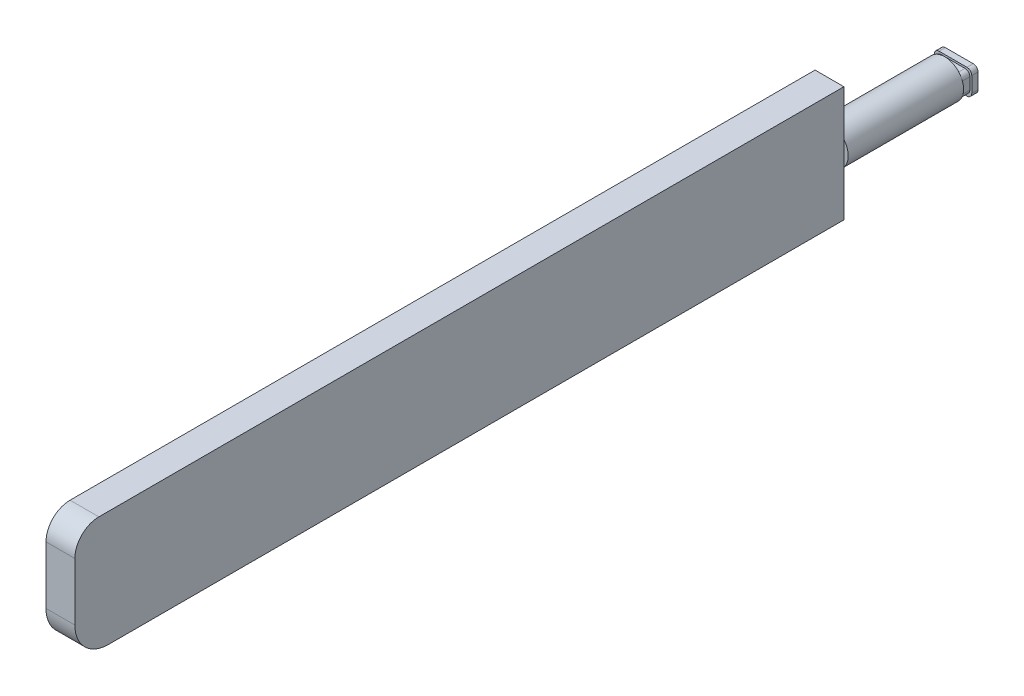
ISO-10303-21;
HEADER;
FILE_DESCRIPTION(('STEP AP214'),'2;1');
FILE_NAME('part.step','',(''),(''),'','','');
FILE_SCHEMA(('AUTOMOTIVE_DESIGN { 1 0 10303 214 1 1 1 1 }'));
ENDSEC;
DATA;
#1=APPLICATION_CONTEXT('core data for automotive mechanical design processes');
#2=APPLICATION_PROTOCOL_DEFINITION('international standard','automotive_design',2000,#1);
#3=PRODUCT_CONTEXT('',#1,'mechanical');
#4=PRODUCT('Part','Part','',(#3));
#5=PRODUCT_RELATED_PRODUCT_CATEGORY('part','',(#4));
#6=PRODUCT_DEFINITION_FORMATION('','',#4);
#7=PRODUCT_DEFINITION_CONTEXT('part definition',#1,'design');
#8=PRODUCT_DEFINITION('design','',#6,#7);
#9=PRODUCT_DEFINITION_SHAPE('','',#8);
#10=(LENGTH_UNIT() NAMED_UNIT(*) SI_UNIT(.MILLI.,.METRE.));
#11=(NAMED_UNIT(*) PLANE_ANGLE_UNIT() SI_UNIT($,.RADIAN.));
#12=(NAMED_UNIT(*) SI_UNIT($,.STERADIAN.) SOLID_ANGLE_UNIT());
#13=UNCERTAINTY_MEASURE_WITH_UNIT(LENGTH_MEASURE(1.E-05),#10,'distance_accuracy_value','');
#14=(GEOMETRIC_REPRESENTATION_CONTEXT(3) GLOBAL_UNCERTAINTY_ASSIGNED_CONTEXT((#13)) GLOBAL_UNIT_ASSIGNED_CONTEXT((#10,
#11,#12)) REPRESENTATION_CONTEXT('',''));
#15=CARTESIAN_POINT('',(0.,0.,0.));
#16=DIRECTION('',(0.,0.,1.));
#17=DIRECTION('',(1.,0.,0.));
#18=AXIS2_PLACEMENT_3D('',#15,#16,#17);
#19=CARTESIAN_POINT('',(15.,-25.,900.));
#20=DIRECTION('',(1.,0.,0.));
#21=DIRECTION('',(0.,0.,-1.));
#22=AXIS2_PLACEMENT_3D('',#19,#20,#21);
#23=CYLINDRICAL_SURFACE('',#22,35.);
#24=DIRECTION('',(1.,0.,0.));
#25=VECTOR('',#24,1.);
#26=CARTESIAN_POINT('',(15.,-25.,935.));
#27=LINE('',#26,#25);
#28=CARTESIAN_POINT('',(-15.,-25.,935.));
#29=VERTEX_POINT('',#28);
#30=CARTESIAN_POINT('',(15.,-25.,935.));
#31=VERTEX_POINT('',#30);
#32=EDGE_CURVE('E375',#29,#31,#27,.T.);
#33=ORIENTED_EDGE('',*,*,#32,.F.);
#34=CARTESIAN_POINT('',(-15.,-25.,900.));
#35=DIRECTION('',(1.,0.,0.));
#36=DIRECTION('',(0.,0.,-1.));
#37=AXIS2_PLACEMENT_3D('',#34,#35,#36);
#38=CIRCLE('',#37,35.);
#39=CARTESIAN_POINT('',(-15.,-60.,900.));
#40=VERTEX_POINT('',#39);
#41=EDGE_CURVE('E47',#40,#29,#38,.F.);
#42=ORIENTED_EDGE('',*,*,#41,.F.);
#43=DIRECTION('',(1.,0.,0.));
#44=VECTOR('',#43,1.);
#45=CARTESIAN_POINT('',(15.,-60.,900.));
#46=LINE('',#45,#44);
#47=CARTESIAN_POINT('',(15.,-60.,900.));
#48=VERTEX_POINT('',#47);
#49=EDGE_CURVE('E374',#48,#40,#46,.F.);
#50=ORIENTED_EDGE('',*,*,#49,.F.);
#51=CARTESIAN_POINT('',(15.,-25.,900.));
#52=DIRECTION('',(1.,0.,0.));
#53=DIRECTION('',(0.,0.,-1.));
#54=AXIS2_PLACEMENT_3D('',#51,#52,#53);
#55=CIRCLE('',#54,35.);
#56=EDGE_CURVE('E11',#31,#48,#55,.T.);
#57=ORIENTED_EDGE('',*,*,#56,.F.);
#58=EDGE_LOOP('',(#33,#42,#50,#57));
#59=FACE_BOUND('',#58,.T.);
#60=ADVANCED_FACE('F45',(#59),#23,.T.);
#61=CARTESIAN_POINT('',(15.,35.,910.));
#62=DIRECTION('',(1.,0.,0.));
#63=DIRECTION('',(0.,0.,-1.));
#64=AXIS2_PLACEMENT_3D('',#61,#62,#63);
#65=CYLINDRICAL_SURFACE('',#64,25.);
#66=DIRECTION('',(1.,0.,0.));
#67=VECTOR('',#66,1.);
#68=CARTESIAN_POINT('',(15.,60.,910.));
#69=LINE('',#68,#67);
#70=CARTESIAN_POINT('',(-15.,60.,910.));
#71=VERTEX_POINT('',#70);
#72=CARTESIAN_POINT('',(15.,60.,910.));
#73=VERTEX_POINT('',#72);
#74=EDGE_CURVE('E217',#71,#73,#69,.T.);
#75=ORIENTED_EDGE('',*,*,#74,.F.);
#76=CARTESIAN_POINT('',(-15.,35.,910.));
#77=DIRECTION('',(1.,0.,0.));
#78=DIRECTION('',(0.,0.,-1.));
#79=AXIS2_PLACEMENT_3D('',#76,#77,#78);
#80=CIRCLE('',#79,25.);
#81=CARTESIAN_POINT('',(-15.,35.,935.));
#82=VERTEX_POINT('',#81);
#83=EDGE_CURVE('E366',#82,#71,#80,.F.);
#84=ORIENTED_EDGE('',*,*,#83,.F.);
#85=DIRECTION('',(1.,0.,0.));
#86=VECTOR('',#85,1.);
#87=CARTESIAN_POINT('',(15.,35.,935.));
#88=LINE('',#87,#86);
#89=CARTESIAN_POINT('',(15.,35.,935.));
#90=VERTEX_POINT('',#89);
#91=EDGE_CURVE('E365',#90,#82,#88,.F.);
#92=ORIENTED_EDGE('',*,*,#91,.F.);
#93=CARTESIAN_POINT('',(15.,35.,910.));
#94=DIRECTION('',(1.,0.,0.));
#95=DIRECTION('',(0.,0.,-1.));
#96=AXIS2_PLACEMENT_3D('',#93,#94,#95);
#97=CIRCLE('',#96,25.);
#98=EDGE_CURVE('E367',#73,#90,#97,.T.);
#99=ORIENTED_EDGE('',*,*,#98,.F.);
#100=EDGE_LOOP('',(#75,#84,#92,#99));
#101=FACE_BOUND('',#100,.T.);
#102=ADVANCED_FACE('F406',(#101),#65,.T.);
#103=CARTESIAN_POINT('',(0.,0.,135.));
#104=DIRECTION('',(0.,0.,1.));
#105=DIRECTION('',(1.,0.,0.));
#106=AXIS2_PLACEMENT_3D('',#103,#104,#105);
#107=PLANE('',#106);
#108=CARTESIAN_POINT('',(0.,0.,135.));
#109=DIRECTION('',(0.,0.,1.));
#110=DIRECTION('',(1.,0.,0.));
#111=AXIS2_PLACEMENT_3D('',#108,#109,#110);
#112=CIRCLE('',#111,19.5);
#113=CARTESIAN_POINT('',(-15.,12.4599357943771,135.));
#114=VERTEX_POINT('',#113);
#115=CARTESIAN_POINT('',(-15.,-12.4599357943771,135.));
#116=VERTEX_POINT('',#115);
#117=EDGE_CURVE('E236',#114,#116,#112,.T.);
#118=ORIENTED_EDGE('',*,*,#117,.T.);
#119=DIRECTION('',(0.,1.,0.));
#120=VECTOR('',#119,1.);
#121=CARTESIAN_POINT('',(-15.,19.5,135.));
#122=LINE('',#121,#120);
#123=EDGE_CURVE('E364',#116,#114,#122,.T.);
#124=ORIENTED_EDGE('',*,*,#123,.T.);
#125=EDGE_LOOP('',(#118,#124));
#126=FACE_BOUND('',#125,.T.);
#127=ADVANCED_FACE('F413',(#126),#107,.T.);
#128=CARTESIAN_POINT('',(19.5,13.,15.));
#129=DIRECTION('',(-1.,0.,0.));
#130=DIRECTION('',(0.,0.,1.));
#131=AXIS2_PLACEMENT_3D('',#128,#129,#130);
#132=PLANE('',#131);
#133=DIRECTION('',(0.,1.,0.));
#134=VECTOR('',#133,1.);
#135=CARTESIAN_POINT('',(19.5,0.,6.5));
#136=LINE('',#135,#134);
#137=CARTESIAN_POINT('',(19.5,-8.,6.5));
#138=VERTEX_POINT('',#137);
#139=CARTESIAN_POINT('',(19.5,8.,6.5));
#140=VERTEX_POINT('',#139);
#141=EDGE_CURVE('E258',#138,#140,#136,.T.);
#142=ORIENTED_EDGE('',*,*,#141,.F.);
#143=DIRECTION('',(0.,0.,-1.));
#144=VECTOR('',#143,1.);
#145=CARTESIAN_POINT('',(19.5,-8.,15.));
#146=LINE('',#145,#144);
#147=CARTESIAN_POINT('',(19.5,-7.99999999999999,0.));
#148=VERTEX_POINT('',#147);
#149=EDGE_CURVE('E288',#138,#148,#146,.T.);
#150=ORIENTED_EDGE('',*,*,#149,.T.);
#151=DIRECTION('',(0.,1.,0.));
#152=VECTOR('',#151,1.);
#153=CARTESIAN_POINT('',(19.5,13.,0.));
#154=LINE('',#153,#152);
#155=CARTESIAN_POINT('',(19.5,8.,0.));
#156=VERTEX_POINT('',#155);
#157=EDGE_CURVE('E264',#148,#156,#154,.T.);
#158=ORIENTED_EDGE('',*,*,#157,.T.);
#159=DIRECTION('',(0.,0.,-1.));
#160=VECTOR('',#159,1.);
#161=CARTESIAN_POINT('',(19.5,8.,15.));
#162=LINE('',#161,#160);
#163=EDGE_CURVE('E287',#156,#140,#162,.F.);
#164=ORIENTED_EDGE('',*,*,#163,.T.);
#165=EDGE_LOOP('',(#142,#150,#158,#164));
#166=FACE_BOUND('',#165,.T.);
#167=ADVANCED_FACE('F418',(#166),#132,.F.);
#168=CARTESIAN_POINT('',(-19.5,13.,15.));
#169=DIRECTION('',(0.,-1.,0.));
#170=DIRECTION('',(0.,0.,-1.));
#171=AXIS2_PLACEMENT_3D('',#168,#169,#170);
#172=PLANE('',#171);
#173=DIRECTION('',(-1.,0.,0.));
#174=VECTOR('',#173,1.);
#175=CARTESIAN_POINT('',(0.,13.,6.5));
#176=LINE('',#175,#174);
#177=CARTESIAN_POINT('',(14.5,13.,6.5));
#178=VERTEX_POINT('',#177);
#179=CARTESIAN_POINT('',(-14.5,13.,6.5));
#180=VERTEX_POINT('',#179);
#181=EDGE_CURVE('E259',#178,#180,#176,.T.);
#182=ORIENTED_EDGE('',*,*,#181,.F.);
#183=DIRECTION('',(0.,0.,-1.));
#184=VECTOR('',#183,1.);
#185=CARTESIAN_POINT('',(14.5,13.,15.));
#186=LINE('',#185,#184);
#187=CARTESIAN_POINT('',(14.5,13.,0.));
#188=VERTEX_POINT('',#187);
#189=EDGE_CURVE('E312',#178,#188,#186,.T.);
#190=ORIENTED_EDGE('',*,*,#189,.T.);
#191=DIRECTION('',(-1.,0.,0.));
#192=VECTOR('',#191,1.);
#193=CARTESIAN_POINT('',(-19.5,13.,0.));
#194=LINE('',#193,#192);
#195=CARTESIAN_POINT('',(-14.5,13.,0.));
#196=VERTEX_POINT('',#195);
#197=EDGE_CURVE('E279',#188,#196,#194,.T.);
#198=ORIENTED_EDGE('',*,*,#197,.T.);
#199=DIRECTION('',(0.,0.,-1.));
#200=VECTOR('',#199,1.);
#201=CARTESIAN_POINT('',(-14.5,13.,15.));
#202=LINE('',#201,#200);
#203=EDGE_CURVE('E311',#196,#180,#202,.F.);
#204=ORIENTED_EDGE('',*,*,#203,.T.);
#205=EDGE_LOOP('',(#182,#190,#198,#204));
#206=FACE_BOUND('',#205,.T.);
#207=ADVANCED_FACE('F457',(#206),#172,.F.);
#208=CARTESIAN_POINT('',(-19.5,13.,15.));
#209=DIRECTION('',(1.,0.,0.));
#210=DIRECTION('',(0.,0.,-1.));
#211=AXIS2_PLACEMENT_3D('',#208,#209,#210);
#212=PLANE('',#211);
#213=DIRECTION('',(0.,-1.,0.));
#214=VECTOR('',#213,1.);
#215=CARTESIAN_POINT('',(-19.5,13.,0.));
#216=LINE('',#215,#214);
#217=CARTESIAN_POINT('',(-19.5,8.,0.));
#218=VERTEX_POINT('',#217);
#219=CARTESIAN_POINT('',(-19.5,-7.99999999999999,0.));
#220=VERTEX_POINT('',#219);
#221=EDGE_CURVE('E283',#218,#220,#216,.T.);
#222=ORIENTED_EDGE('',*,*,#221,.T.);
#223=DIRECTION('',(0.,0.,-1.));
#224=VECTOR('',#223,1.);
#225=CARTESIAN_POINT('',(-19.5,-8.,15.));
#226=LINE('',#225,#224);
#227=CARTESIAN_POINT('',(-19.5,-8.,6.5));
#228=VERTEX_POINT('',#227);
#229=EDGE_CURVE('E321',#220,#228,#226,.F.);
#230=ORIENTED_EDGE('',*,*,#229,.T.);
#231=DIRECTION('',(0.,-1.,0.));
#232=VECTOR('',#231,1.);
#233=CARTESIAN_POINT('',(-19.5,0.,6.5));
#234=LINE('',#233,#232);
#235=CARTESIAN_POINT('',(-19.5,8.,6.5));
#236=VERTEX_POINT('',#235);
#237=EDGE_CURVE('E265',#236,#228,#234,.T.);
#238=ORIENTED_EDGE('',*,*,#237,.F.);
#239=DIRECTION('',(0.,0.,-1.));
#240=VECTOR('',#239,1.);
#241=CARTESIAN_POINT('',(-19.5,8.,15.));
#242=LINE('',#241,#240);
#243=EDGE_CURVE('E318',#236,#218,#242,.T.);
#244=ORIENTED_EDGE('',*,*,#243,.T.);
#245=EDGE_LOOP('',(#222,#230,#238,#244));
#246=FACE_BOUND('',#245,.T.);
#247=ADVANCED_FACE('F458',(#246),#212,.F.);
#248=CARTESIAN_POINT('',(-19.5,-13.,15.));
#249=DIRECTION('',(0.,1.,0.));
#250=DIRECTION('',(0.,0.,1.));
#251=AXIS2_PLACEMENT_3D('',#248,#249,#250);
#252=PLANE('',#251);
#253=DIRECTION('',(1.,0.,0.));
#254=VECTOR('',#253,1.);
#255=CARTESIAN_POINT('',(-19.5,-13.,0.));
#256=LINE('',#255,#254);
#257=CARTESIAN_POINT('',(-14.5,-13.,0.));
#258=VERTEX_POINT('',#257);
#259=CARTESIAN_POINT('',(14.5,-13.,0.));
#260=VERTEX_POINT('',#259);
#261=EDGE_CURVE('E282',#258,#260,#256,.T.);
#262=ORIENTED_EDGE('',*,*,#261,.T.);
#263=DIRECTION('',(0.,0.,-1.));
#264=VECTOR('',#263,1.);
#265=CARTESIAN_POINT('',(14.5,-13.,15.));
#266=LINE('',#265,#264);
#267=CARTESIAN_POINT('',(14.5,-13.,6.5));
#268=VERTEX_POINT('',#267);
#269=EDGE_CURVE('E302',#260,#268,#266,.F.);
#270=ORIENTED_EDGE('',*,*,#269,.T.);
#271=DIRECTION('',(1.,0.,0.));
#272=VECTOR('',#271,1.);
#273=CARTESIAN_POINT('',(0.,-13.,6.5));
#274=LINE('',#273,#272);
#275=CARTESIAN_POINT('',(-14.5,-13.,6.5));
#276=VERTEX_POINT('',#275);
#277=EDGE_CURVE('E251',#276,#268,#274,.T.);
#278=ORIENTED_EDGE('',*,*,#277,.F.);
#279=DIRECTION('',(0.,0.,-1.));
#280=VECTOR('',#279,1.);
#281=CARTESIAN_POINT('',(-14.5,-13.,15.));
#282=LINE('',#281,#280);
#283=EDGE_CURVE('E299',#276,#258,#282,.T.);
#284=ORIENTED_EDGE('',*,*,#283,.T.);
#285=EDGE_LOOP('',(#262,#270,#278,#284));
#286=FACE_BOUND('',#285,.T.);
#287=ADVANCED_FACE('F462',(#286),#252,.F.);
#288=CARTESIAN_POINT('',(0.,0.,0.));
#289=DIRECTION('',(0.,0.,1.));
#290=DIRECTION('',(1.,0.,0.));
#291=AXIS2_PLACEMENT_3D('',#288,#289,#290);
#292=PLANE('',#291);
#293=ORIENTED_EDGE('',*,*,#157,.F.);
#294=CARTESIAN_POINT('',(14.5,-8.,0.));
#295=DIRECTION('',(0.,0.,1.));
#296=DIRECTION('',(1.,0.,0.));
#297=AXIS2_PLACEMENT_3D('',#294,#295,#296);
#298=CIRCLE('',#297,5.);
#299=EDGE_CURVE('E296',#148,#260,#298,.F.);
#300=ORIENTED_EDGE('',*,*,#299,.T.);
#301=ORIENTED_EDGE('',*,*,#261,.F.);
#302=CARTESIAN_POINT('',(-14.5,-8.,0.));
#303=DIRECTION('',(0.,0.,1.));
#304=DIRECTION('',(1.,0.,0.));
#305=AXIS2_PLACEMENT_3D('',#302,#303,#304);
#306=CIRCLE('',#305,5.);
#307=EDGE_CURVE('E294',#258,#220,#306,.F.);
#308=ORIENTED_EDGE('',*,*,#307,.T.);
#309=ORIENTED_EDGE('',*,*,#221,.F.);
#310=CARTESIAN_POINT('',(-14.5,8.,0.));
#311=DIRECTION('',(0.,0.,1.));
#312=DIRECTION('',(1.,0.,0.));
#313=AXIS2_PLACEMENT_3D('',#310,#311,#312);
#314=CIRCLE('',#313,5.);
#315=EDGE_CURVE('E295',#218,#196,#314,.F.);
#316=ORIENTED_EDGE('',*,*,#315,.T.);
#317=ORIENTED_EDGE('',*,*,#197,.F.);
#318=CARTESIAN_POINT('',(14.5,8.,0.));
#319=DIRECTION('',(0.,0.,1.));
#320=DIRECTION('',(1.,0.,0.));
#321=AXIS2_PLACEMENT_3D('',#318,#319,#320);
#322=CIRCLE('',#321,5.);
#323=EDGE_CURVE('E298',#188,#156,#322,.F.);
#324=ORIENTED_EDGE('',*,*,#323,.T.);
#325=EDGE_LOOP('',(#293,#300,#301,#308,#309,#316,#317,#324));
#326=FACE_BOUND('',#325,.T.);
#327=ADVANCED_FACE('F467',(#326),#292,.F.);
#328=CARTESIAN_POINT('',(17.5,0.,6.5));
#329=DIRECTION('',(1.,0.,0.));
#330=DIRECTION('',(0.,0.,-1.));
#331=AXIS2_PLACEMENT_3D('',#328,#329,#330);
#332=PLANE('',#331);
#333=DIRECTION('',(0.,1.,0.));
#334=VECTOR('',#333,1.);
#335=CARTESIAN_POINT('',(17.5,0.,15.));
#336=LINE('',#335,#334);
#337=CARTESIAN_POINT('',(17.5,-6.,15.));
#338=VERTEX_POINT('',#337);
#339=CARTESIAN_POINT('',(17.5,6.,15.));
#340=VERTEX_POINT('',#339);
#341=EDGE_CURVE('E240',#338,#340,#336,.T.);
#342=ORIENTED_EDGE('',*,*,#341,.F.);
#343=DIRECTION('',(0.,0.,1.));
#344=VECTOR('',#343,1.);
#345=CARTESIAN_POINT('',(17.5,-6.,6.5));
#346=LINE('',#345,#344);
#347=CARTESIAN_POINT('',(17.5,-6.,6.5));
#348=VERTEX_POINT('',#347);
#349=EDGE_CURVE('E346',#338,#348,#346,.F.);
#350=ORIENTED_EDGE('',*,*,#349,.T.);
#351=DIRECTION('',(0.,1.,0.));
#352=VECTOR('',#351,1.);
#353=CARTESIAN_POINT('',(17.5,0.,6.5));
#354=LINE('',#353,#352);
#355=CARTESIAN_POINT('',(17.5,6.,6.5));
#356=VERTEX_POINT('',#355);
#357=EDGE_CURVE('E238',#348,#356,#354,.T.);
#358=ORIENTED_EDGE('',*,*,#357,.T.);
#359=DIRECTION('',(0.,0.,1.));
#360=VECTOR('',#359,1.);
#361=CARTESIAN_POINT('',(17.5,6.,6.5));
#362=LINE('',#361,#360);
#363=EDGE_CURVE('E345',#356,#340,#362,.T.);
#364=ORIENTED_EDGE('',*,*,#363,.T.);
#365=EDGE_LOOP('',(#342,#350,#358,#364));
#366=FACE_BOUND('',#365,.T.);
#367=ADVANCED_FACE('F472',(#366),#332,.T.);
#368=CARTESIAN_POINT('',(0.,11.,6.5));
#369=DIRECTION('',(0.,1.,0.));
#370=DIRECTION('',(0.,0.,1.));
#371=AXIS2_PLACEMENT_3D('',#368,#369,#370);
#372=PLANE('',#371);
#373=DIRECTION('',(-1.,0.,0.));
#374=VECTOR('',#373,1.);
#375=CARTESIAN_POINT('',(0.,11.,15.));
#376=LINE('',#375,#374);
#377=CARTESIAN_POINT('',(12.5,11.,15.));
#378=VERTEX_POINT('',#377);
#379=CARTESIAN_POINT('',(-12.5,11.,15.));
#380=VERTEX_POINT('',#379);
#381=EDGE_CURVE('E242',#378,#380,#376,.T.);
#382=ORIENTED_EDGE('',*,*,#381,.F.);
#383=DIRECTION('',(0.,0.,1.));
#384=VECTOR('',#383,1.);
#385=CARTESIAN_POINT('',(12.5,11.,6.5));
#386=LINE('',#385,#384);
#387=CARTESIAN_POINT('',(12.5,11.,6.5));
#388=VERTEX_POINT('',#387);
#389=EDGE_CURVE('E351',#378,#388,#386,.F.);
#390=ORIENTED_EDGE('',*,*,#389,.T.);
#391=DIRECTION('',(-1.,0.,0.));
#392=VECTOR('',#391,1.);
#393=CARTESIAN_POINT('',(0.,11.,6.5));
#394=LINE('',#393,#392);
#395=CARTESIAN_POINT('',(-12.5,11.,6.5));
#396=VERTEX_POINT('',#395);
#397=EDGE_CURVE('E246',#388,#396,#394,.T.);
#398=ORIENTED_EDGE('',*,*,#397,.T.);
#399=DIRECTION('',(0.,0.,1.));
#400=VECTOR('',#399,1.);
#401=CARTESIAN_POINT('',(-12.5,11.,6.5));
#402=LINE('',#401,#400);
#403=EDGE_CURVE('E348',#396,#380,#402,.T.);
#404=ORIENTED_EDGE('',*,*,#403,.T.);
#405=EDGE_LOOP('',(#382,#390,#398,#404));
#406=FACE_BOUND('',#405,.T.);
#407=ADVANCED_FACE('F478',(#406),#372,.T.);
#408=CARTESIAN_POINT('',(-17.5,0.,6.5));
#409=DIRECTION('',(-1.,0.,0.));
#410=DIRECTION('',(0.,0.,1.));
#411=AXIS2_PLACEMENT_3D('',#408,#409,#410);
#412=PLANE('',#411);
#413=DIRECTION('',(0.,-1.,0.));
#414=VECTOR('',#413,1.);
#415=CARTESIAN_POINT('',(-17.5,0.,6.5));
#416=LINE('',#415,#414);
#417=CARTESIAN_POINT('',(-17.5,6.,6.5));
#418=VERTEX_POINT('',#417);
#419=CARTESIAN_POINT('',(-17.5,-6.,6.5));
#420=VERTEX_POINT('',#419);
#421=EDGE_CURVE('E249',#418,#420,#416,.T.);
#422=ORIENTED_EDGE('',*,*,#421,.T.);
#423=DIRECTION('',(0.,0.,1.));
#424=VECTOR('',#423,1.);
#425=CARTESIAN_POINT('',(-17.5,-6.,6.5));
#426=LINE('',#425,#424);
#427=CARTESIAN_POINT('',(-17.5,-6.,15.));
#428=VERTEX_POINT('',#427);
#429=EDGE_CURVE('E324',#420,#428,#426,.T.);
#430=ORIENTED_EDGE('',*,*,#429,.T.);
#431=DIRECTION('',(0.,-1.,0.));
#432=VECTOR('',#431,1.);
#433=CARTESIAN_POINT('',(-17.5,0.,15.));
#434=LINE('',#433,#432);
#435=CARTESIAN_POINT('',(-17.5,6.,15.));
#436=VERTEX_POINT('',#435);
#437=EDGE_CURVE('E271',#436,#428,#434,.T.);
#438=ORIENTED_EDGE('',*,*,#437,.F.);
#439=DIRECTION('',(0.,0.,1.));
#440=VECTOR('',#439,1.);
#441=CARTESIAN_POINT('',(-17.5,6.,6.5));
#442=LINE('',#441,#440);
#443=EDGE_CURVE('E323',#436,#418,#442,.F.);
#444=ORIENTED_EDGE('',*,*,#443,.T.);
#445=EDGE_LOOP('',(#422,#430,#438,#444));
#446=FACE_BOUND('',#445,.T.);
#447=ADVANCED_FACE('F481',(#446),#412,.T.);
#448=CARTESIAN_POINT('',(0.,-11.,6.5));
#449=DIRECTION('',(0.,-1.,0.));
#450=DIRECTION('',(0.,0.,-1.));
#451=AXIS2_PLACEMENT_3D('',#448,#449,#450);
#452=PLANE('',#451);
#453=DIRECTION('',(1.,0.,0.));
#454=VECTOR('',#453,1.);
#455=CARTESIAN_POINT('',(0.,-11.,15.));
#456=LINE('',#455,#454);
#457=CARTESIAN_POINT('',(-12.5,-11.,15.));
#458=VERTEX_POINT('',#457);
#459=CARTESIAN_POINT('',(12.5,-11.,15.));
#460=VERTEX_POINT('',#459);
#461=EDGE_CURVE('E268',#458,#460,#456,.T.);
#462=ORIENTED_EDGE('',*,*,#461,.F.);
#463=DIRECTION('',(0.,0.,1.));
#464=VECTOR('',#463,1.);
#465=CARTESIAN_POINT('',(-12.5,-11.,6.5));
#466=LINE('',#465,#464);
#467=CARTESIAN_POINT('',(-12.5,-11.,6.5));
#468=VERTEX_POINT('',#467);
#469=EDGE_CURVE('E344',#458,#468,#466,.F.);
#470=ORIENTED_EDGE('',*,*,#469,.T.);
#471=DIRECTION('',(1.,0.,0.));
#472=VECTOR('',#471,1.);
#473=CARTESIAN_POINT('',(0.,-11.,6.5));
#474=LINE('',#473,#472);
#475=CARTESIAN_POINT('',(12.5,-11.,6.5));
#476=VERTEX_POINT('',#475);
#477=EDGE_CURVE('E241',#468,#476,#474,.T.);
#478=ORIENTED_EDGE('',*,*,#477,.T.);
#479=DIRECTION('',(0.,0.,1.));
#480=VECTOR('',#479,1.);
#481=CARTESIAN_POINT('',(12.5,-11.,6.5));
#482=LINE('',#481,#480);
#483=EDGE_CURVE('E339',#476,#460,#482,.T.);
#484=ORIENTED_EDGE('',*,*,#483,.T.);
#485=EDGE_LOOP('',(#462,#470,#478,#484));
#486=FACE_BOUND('',#485,.T.);
#487=ADVANCED_FACE('F476',(#486),#452,.T.);
#488=CARTESIAN_POINT('',(0.,0.,6.5));
#489=DIRECTION('',(0.,0.,1.));
#490=DIRECTION('',(1.,0.,0.));
#491=AXIS2_PLACEMENT_3D('',#488,#489,#490);
#492=PLANE('',#491);
#493=ORIENTED_EDGE('',*,*,#357,.F.);
#494=CARTESIAN_POINT('',(12.5,-6.,6.5));
#495=DIRECTION('',(0.,0.,1.));
#496=DIRECTION('',(1.,0.,0.));
#497=AXIS2_PLACEMENT_3D('',#494,#495,#496);
#498=CIRCLE('',#497,5.);
#499=EDGE_CURVE('E359',#348,#476,#498,.F.);
#500=ORIENTED_EDGE('',*,*,#499,.T.);
#501=ORIENTED_EDGE('',*,*,#477,.F.);
#502=CARTESIAN_POINT('',(-12.5,-6.,6.5));
#503=DIRECTION('',(0.,0.,1.));
#504=DIRECTION('',(1.,0.,0.));
#505=AXIS2_PLACEMENT_3D('',#502,#503,#504);
#506=CIRCLE('',#505,5.);
#507=EDGE_CURVE('E354',#468,#420,#506,.F.);
#508=ORIENTED_EDGE('',*,*,#507,.T.);
#509=ORIENTED_EDGE('',*,*,#421,.F.);
#510=CARTESIAN_POINT('',(-12.5,6.,6.5));
#511=DIRECTION('',(0.,0.,1.));
#512=DIRECTION('',(1.,0.,0.));
#513=AXIS2_PLACEMENT_3D('',#510,#511,#512);
#514=CIRCLE('',#513,5.);
#515=EDGE_CURVE('E363',#418,#396,#514,.F.);
#516=ORIENTED_EDGE('',*,*,#515,.T.);
#517=ORIENTED_EDGE('',*,*,#397,.F.);
#518=CARTESIAN_POINT('',(12.5,6.,6.5));
#519=DIRECTION('',(0.,0.,1.));
#520=DIRECTION('',(1.,0.,0.));
#521=AXIS2_PLACEMENT_3D('',#518,#519,#520);
#522=CIRCLE('',#521,5.);
#523=EDGE_CURVE('E360',#388,#356,#522,.F.);
#524=ORIENTED_EDGE('',*,*,#523,.T.);
#525=EDGE_LOOP('',(#493,#500,#501,#508,#509,#516,#517,#524));
#526=FACE_BOUND('',#525,.T.);
#527=ORIENTED_EDGE('',*,*,#277,.T.);
#528=CARTESIAN_POINT('',(14.5,-8.,6.5));
#529=DIRECTION('',(0.,0.,1.));
#530=DIRECTION('',(1.,0.,0.));
#531=AXIS2_PLACEMENT_3D('',#528,#529,#530);
#532=CIRCLE('',#531,5.);
#533=EDGE_CURVE('E313',#268,#138,#532,.T.);
#534=ORIENTED_EDGE('',*,*,#533,.T.);
#535=ORIENTED_EDGE('',*,*,#141,.T.);
#536=CARTESIAN_POINT('',(14.5,8.,6.5));
#537=DIRECTION('',(0.,0.,1.));
#538=DIRECTION('',(1.,0.,0.));
#539=AXIS2_PLACEMENT_3D('',#536,#537,#538);
#540=CIRCLE('',#539,5.);
#541=EDGE_CURVE('E310',#140,#178,#540,.T.);
#542=ORIENTED_EDGE('',*,*,#541,.T.);
#543=ORIENTED_EDGE('',*,*,#181,.T.);
#544=CARTESIAN_POINT('',(-14.5,8.,6.5));
#545=DIRECTION('',(0.,0.,1.));
#546=DIRECTION('',(1.,0.,0.));
#547=AXIS2_PLACEMENT_3D('',#544,#545,#546);
#548=CIRCLE('',#547,5.);
#549=EDGE_CURVE('E301',#180,#236,#548,.T.);
#550=ORIENTED_EDGE('',*,*,#549,.T.);
#551=ORIENTED_EDGE('',*,*,#237,.T.);
#552=CARTESIAN_POINT('',(-14.5,-8.,6.5));
#553=DIRECTION('',(0.,0.,1.));
#554=DIRECTION('',(1.,0.,0.));
#555=AXIS2_PLACEMENT_3D('',#552,#553,#554);
#556=CIRCLE('',#555,5.);
#557=EDGE_CURVE('E307',#228,#276,#556,.T.);
#558=ORIENTED_EDGE('',*,*,#557,.T.);
#559=EDGE_LOOP('',(#527,#534,#535,#542,#543,#550,#551,#558));
#560=FACE_BOUND('',#559,.T.);
#561=ADVANCED_FACE('F452',(#526,#560),#492,.T.);
#562=CARTESIAN_POINT('',(14.5,-8.,15.));
#563=DIRECTION('',(0.,0.,-1.));
#564=DIRECTION('',(-1.,0.,0.));
#565=AXIS2_PLACEMENT_3D('',#562,#563,#564);
#566=CYLINDRICAL_SURFACE('',#565,5.);
#567=ORIENTED_EDGE('',*,*,#533,.F.);
#568=ORIENTED_EDGE('',*,*,#269,.F.);
#569=ORIENTED_EDGE('',*,*,#299,.F.);
#570=ORIENTED_EDGE('',*,*,#149,.F.);
#571=EDGE_LOOP('',(#567,#568,#569,#570));
#572=FACE_BOUND('',#571,.T.);
#573=ADVANCED_FACE('F446',(#572),#566,.T.);
#574=CARTESIAN_POINT('',(14.5,8.,15.));
#575=DIRECTION('',(0.,0.,-1.));
#576=DIRECTION('',(-1.,0.,0.));
#577=AXIS2_PLACEMENT_3D('',#574,#575,#576);
#578=CYLINDRICAL_SURFACE('',#577,5.);
#579=ORIENTED_EDGE('',*,*,#541,.F.);
#580=ORIENTED_EDGE('',*,*,#163,.F.);
#581=ORIENTED_EDGE('',*,*,#323,.F.);
#582=ORIENTED_EDGE('',*,*,#189,.F.);
#583=EDGE_LOOP('',(#579,#580,#581,#582));
#584=FACE_BOUND('',#583,.T.);
#585=ADVANCED_FACE('F441',(#584),#578,.T.);
#586=CARTESIAN_POINT('',(-14.5,-8.,15.));
#587=DIRECTION('',(0.,0.,-1.));
#588=DIRECTION('',(-1.,0.,0.));
#589=AXIS2_PLACEMENT_3D('',#586,#587,#588);
#590=CYLINDRICAL_SURFACE('',#589,5.);
#591=ORIENTED_EDGE('',*,*,#557,.F.);
#592=ORIENTED_EDGE('',*,*,#229,.F.);
#593=ORIENTED_EDGE('',*,*,#307,.F.);
#594=ORIENTED_EDGE('',*,*,#283,.F.);
#595=EDGE_LOOP('',(#591,#592,#593,#594));
#596=FACE_BOUND('',#595,.T.);
#597=ADVANCED_FACE('F439',(#596),#590,.T.);
#598=CARTESIAN_POINT('',(-14.5,8.,15.));
#599=DIRECTION('',(0.,0.,-1.));
#600=DIRECTION('',(-1.,0.,0.));
#601=AXIS2_PLACEMENT_3D('',#598,#599,#600);
#602=CYLINDRICAL_SURFACE('',#601,5.);
#603=ORIENTED_EDGE('',*,*,#549,.F.);
#604=ORIENTED_EDGE('',*,*,#203,.F.);
#605=ORIENTED_EDGE('',*,*,#315,.F.);
#606=ORIENTED_EDGE('',*,*,#243,.F.);
#607=EDGE_LOOP('',(#603,#604,#605,#606));
#608=FACE_BOUND('',#607,.T.);
#609=ADVANCED_FACE('F436',(#608),#602,.T.);
#610=CARTESIAN_POINT('',(-12.5,-6.,6.5));
#611=DIRECTION('',(0.,0.,1.));
#612=DIRECTION('',(1.,0.,0.));
#613=AXIS2_PLACEMENT_3D('',#610,#611,#612);
#614=CYLINDRICAL_SURFACE('',#613,5.);
#615=ORIENTED_EDGE('',*,*,#507,.F.);
#616=ORIENTED_EDGE('',*,*,#469,.F.);
#617=CARTESIAN_POINT('',(-12.5,-6.,15.));
#618=DIRECTION('',(0.,0.,1.));
#619=DIRECTION('',(1.,0.,0.));
#620=AXIS2_PLACEMENT_3D('',#617,#618,#619);
#621=CIRCLE('',#620,5.);
#622=EDGE_CURVE('E340',#428,#458,#621,.T.);
#623=ORIENTED_EDGE('',*,*,#622,.F.);
#624=ORIENTED_EDGE('',*,*,#429,.F.);
#625=EDGE_LOOP('',(#615,#616,#623,#624));
#626=FACE_BOUND('',#625,.T.);
#627=ADVANCED_FACE('F435',(#626),#614,.T.);
#628=CARTESIAN_POINT('',(12.5,-6.,6.5));
#629=DIRECTION('',(0.,0.,1.));
#630=DIRECTION('',(1.,0.,0.));
#631=AXIS2_PLACEMENT_3D('',#628,#629,#630);
#632=CYLINDRICAL_SURFACE('',#631,5.);
#633=ORIENTED_EDGE('',*,*,#499,.F.);
#634=ORIENTED_EDGE('',*,*,#349,.F.);
#635=CARTESIAN_POINT('',(12.5,-6.,15.));
#636=DIRECTION('',(0.,0.,1.));
#637=DIRECTION('',(1.,0.,0.));
#638=AXIS2_PLACEMENT_3D('',#635,#636,#637);
#639=CIRCLE('',#638,5.);
#640=EDGE_CURVE('E331',#460,#338,#639,.T.);
#641=ORIENTED_EDGE('',*,*,#640,.F.);
#642=ORIENTED_EDGE('',*,*,#483,.F.);
#643=EDGE_LOOP('',(#633,#634,#641,#642));
#644=FACE_BOUND('',#643,.T.);
#645=ADVANCED_FACE('F428',(#644),#632,.T.);
#646=CARTESIAN_POINT('',(12.5,6.,6.5));
#647=DIRECTION('',(0.,0.,1.));
#648=DIRECTION('',(1.,0.,0.));
#649=AXIS2_PLACEMENT_3D('',#646,#647,#648);
#650=CYLINDRICAL_SURFACE('',#649,5.);
#651=ORIENTED_EDGE('',*,*,#523,.F.);
#652=ORIENTED_EDGE('',*,*,#389,.F.);
#653=CARTESIAN_POINT('',(12.5,6.,15.));
#654=DIRECTION('',(0.,0.,1.));
#655=DIRECTION('',(1.,0.,0.));
#656=AXIS2_PLACEMENT_3D('',#653,#654,#655);
#657=CIRCLE('',#656,5.);
#658=EDGE_CURVE('E332',#340,#378,#657,.T.);
#659=ORIENTED_EDGE('',*,*,#658,.F.);
#660=ORIENTED_EDGE('',*,*,#363,.F.);
#661=EDGE_LOOP('',(#651,#652,#659,#660));
#662=FACE_BOUND('',#661,.T.);
#663=ADVANCED_FACE('F424',(#662),#650,.T.);
#664=CARTESIAN_POINT('',(-12.5,6.,6.5));
#665=DIRECTION('',(0.,0.,1.));
#666=DIRECTION('',(1.,0.,0.));
#667=AXIS2_PLACEMENT_3D('',#664,#665,#666);
#668=CYLINDRICAL_SURFACE('',#667,5.);
#669=ORIENTED_EDGE('',*,*,#515,.F.);
#670=ORIENTED_EDGE('',*,*,#443,.F.);
#671=CARTESIAN_POINT('',(-12.5,6.,15.));
#672=DIRECTION('',(0.,0.,1.));
#673=DIRECTION('',(1.,0.,0.));
#674=AXIS2_PLACEMENT_3D('',#671,#672,#673);
#675=CIRCLE('',#674,5.);
#676=EDGE_CURVE('E327',#380,#436,#675,.T.);
#677=ORIENTED_EDGE('',*,*,#676,.F.);
#678=ORIENTED_EDGE('',*,*,#403,.F.);
#679=EDGE_LOOP('',(#669,#670,#677,#678));
#680=FACE_BOUND('',#679,.T.);
#681=ADVANCED_FACE('F419',(#680),#668,.T.);
#682=CARTESIAN_POINT('',(0.,0.,135.));
#683=DIRECTION('',(0.,0.,-1.));
#684=DIRECTION('',(-1.,0.,0.));
#685=AXIS2_PLACEMENT_3D('',#682,#683,#684);
#686=CYLINDRICAL_SURFACE('',#685,19.5);
#687=CARTESIAN_POINT('',(15.,12.4599357943771,135.));
#688=VERTEX_POINT('',#687);
#689=EDGE_CURVE('E237',#688,#114,#112,.T.);
#690=ORIENTED_EDGE('',*,*,#689,.F.);
#691=CARTESIAN_POINT('',(15.,-12.4599357943771,135.));
#692=VERTEX_POINT('',#691);
#693=EDGE_CURVE('E227',#692,#688,#112,.T.);
#694=ORIENTED_EDGE('',*,*,#693,.F.);
#695=EDGE_CURVE('E404',#116,#692,#112,.T.);
#696=ORIENTED_EDGE('',*,*,#695,.F.);
#697=ORIENTED_EDGE('',*,*,#117,.F.);
#698=EDGE_LOOP('',(#690,#694,#696,#697));
#699=FACE_BOUND('',#698,.T.);
#700=CARTESIAN_POINT('',(0.,0.,15.));
#701=DIRECTION('',(0.,0.,1.));
#702=DIRECTION('',(1.,0.,0.));
#703=AXIS2_PLACEMENT_3D('',#700,#701,#702);
#704=CIRCLE('',#703,19.5);
#705=CARTESIAN_POINT('',(19.5,0.,15.));
#706=VERTEX_POINT('',#705);
#707=EDGE_CURVE('E223',#706,#706,#704,.T.);
#708=ORIENTED_EDGE('',*,*,#707,.T.);
#709=EDGE_LOOP('',(#708));
#710=FACE_BOUND('',#709,.T.);
#711=ADVANCED_FACE('F421',(#699,#710),#686,.T.);
#712=DIRECTION('',(0.,1.,0.));
#713=VECTOR('',#712,1.);
#714=CARTESIAN_POINT('',(15.,60.,135.));
#715=LINE('',#714,#713);
#716=EDGE_CURVE('E204',#692,#688,#715,.T.);
#717=ORIENTED_EDGE('',*,*,#716,.F.);
#718=ORIENTED_EDGE('',*,*,#693,.T.);
#719=EDGE_LOOP('',(#717,#718));
#720=FACE_BOUND('',#719,.T.);
#721=ADVANCED_FACE('F416',(#720),#107,.T.);
#722=CARTESIAN_POINT('',(0.,0.,15.));
#723=DIRECTION('',(0.,0.,1.));
#724=DIRECTION('',(1.,0.,0.));
#725=AXIS2_PLACEMENT_3D('',#722,#723,#724);
#726=PLANE('',#725);
#727=ORIENTED_EDGE('',*,*,#676,.T.);
#728=ORIENTED_EDGE('',*,*,#437,.T.);
#729=ORIENTED_EDGE('',*,*,#622,.T.);
#730=ORIENTED_EDGE('',*,*,#461,.T.);
#731=ORIENTED_EDGE('',*,*,#640,.T.);
#732=ORIENTED_EDGE('',*,*,#341,.T.);
#733=ORIENTED_EDGE('',*,*,#658,.T.);
#734=ORIENTED_EDGE('',*,*,#381,.T.);
#735=EDGE_LOOP('',(#727,#728,#729,#730,#731,#732,#733,#734));
#736=FACE_BOUND('',#735,.T.);
#737=ORIENTED_EDGE('',*,*,#707,.F.);
#738=EDGE_LOOP('',(#737));
#739=FACE_BOUND('',#738,.T.);
#740=ADVANCED_FACE('F494',(#736,#739),#726,.F.);
#741=CARTESIAN_POINT('',(15.,19.5,135.));
#742=DIRECTION('',(0.,0.,1.));
#743=DIRECTION('',(1.,0.,0.));
#744=AXIS2_PLACEMENT_3D('',#741,#742,#743);
#745=PLANE('',#744);
#746=CARTESIAN_POINT('',(15.,60.,135.));
#747=VERTEX_POINT('',#746);
#748=EDGE_CURVE('E200',#688,#747,#715,.T.);
#749=ORIENTED_EDGE('',*,*,#748,.F.);
#750=ORIENTED_EDGE('',*,*,#689,.T.);
#751=CARTESIAN_POINT('',(-15.,60.,135.));
#752=VERTEX_POINT('',#751);
#753=EDGE_CURVE('E224',#114,#752,#122,.T.);
#754=ORIENTED_EDGE('',*,*,#753,.T.);
#755=DIRECTION('',(-1.,0.,0.));
#756=VECTOR('',#755,1.);
#757=CARTESIAN_POINT('',(15.,60.,135.));
#758=LINE('',#757,#756);
#759=EDGE_CURVE('E216',#747,#752,#758,.T.);
#760=ORIENTED_EDGE('',*,*,#759,.F.);
#761=EDGE_LOOP('',(#749,#750,#754,#760));
#762=FACE_BOUND('',#761,.T.);
#763=ADVANCED_FACE('F222',(#762),#745,.F.);
#764=CARTESIAN_POINT('',(-15.,-60.,135.));
#765=VERTEX_POINT('',#764);
#766=EDGE_CURVE('E207',#765,#116,#122,.T.);
#767=ORIENTED_EDGE('',*,*,#766,.T.);
#768=ORIENTED_EDGE('',*,*,#695,.T.);
#769=CARTESIAN_POINT('',(15.,-60.,135.));
#770=VERTEX_POINT('',#769);
#771=EDGE_CURVE('E208',#770,#692,#715,.T.);
#772=ORIENTED_EDGE('',*,*,#771,.F.);
#773=DIRECTION('',(-1.,0.,0.));
#774=VECTOR('',#773,1.);
#775=CARTESIAN_POINT('',(15.,-60.,135.));
#776=LINE('',#775,#774);
#777=EDGE_CURVE('E228',#770,#765,#776,.T.);
#778=ORIENTED_EDGE('',*,*,#777,.T.);
#779=EDGE_LOOP('',(#767,#768,#772,#778));
#780=FACE_BOUND('',#779,.T.);
#781=ADVANCED_FACE('F401',(#780),#745,.F.);
#782=CARTESIAN_POINT('',(15.,60.,135.));
#783=DIRECTION('',(0.,-1.,0.));
#784=DIRECTION('',(0.,0.,-1.));
#785=AXIS2_PLACEMENT_3D('',#782,#783,#784);
#786=PLANE('',#785);
#787=DIRECTION('',(0.,0.,1.));
#788=VECTOR('',#787,1.);
#789=CARTESIAN_POINT('',(-15.,60.,135.));
#790=LINE('',#789,#788);
#791=EDGE_CURVE('E389',#752,#71,#790,.T.);
#792=ORIENTED_EDGE('',*,*,#791,.T.);
#793=ORIENTED_EDGE('',*,*,#74,.T.);
#794=DIRECTION('',(0.,0.,1.));
#795=VECTOR('',#794,1.);
#796=CARTESIAN_POINT('',(15.,60.,135.));
#797=LINE('',#796,#795);
#798=EDGE_CURVE('E205',#747,#73,#797,.T.);
#799=ORIENTED_EDGE('',*,*,#798,.F.);
#800=ORIENTED_EDGE('',*,*,#759,.T.);
#801=EDGE_LOOP('',(#792,#793,#799,#800));
#802=FACE_BOUND('',#801,.T.);
#803=ADVANCED_FACE('F214',(#802),#786,.F.);
#804=CARTESIAN_POINT('',(15.,60.,935.));
#805=DIRECTION('',(0.,0.,-1.));
#806=DIRECTION('',(-1.,0.,0.));
#807=AXIS2_PLACEMENT_3D('',#804,#805,#806);
#808=PLANE('',#807);
#809=DIRECTION('',(0.,-1.,0.));
#810=VECTOR('',#809,1.);
#811=CARTESIAN_POINT('',(-15.,60.,935.));
#812=LINE('',#811,#810);
#813=EDGE_CURVE('E381',#82,#29,#812,.T.);
#814=ORIENTED_EDGE('',*,*,#813,.T.);
#815=ORIENTED_EDGE('',*,*,#32,.T.);
#816=DIRECTION('',(0.,-1.,0.));
#817=VECTOR('',#816,1.);
#818=CARTESIAN_POINT('',(15.,60.,935.));
#819=LINE('',#818,#817);
#820=EDGE_CURVE('E218',#90,#31,#819,.T.);
#821=ORIENTED_EDGE('',*,*,#820,.F.);
#822=ORIENTED_EDGE('',*,*,#91,.T.);
#823=EDGE_LOOP('',(#814,#815,#821,#822));
#824=FACE_BOUND('',#823,.T.);
#825=ADVANCED_FACE('F387',(#824),#808,.F.);
#826=CARTESIAN_POINT('',(15.,-60.,935.));
#827=DIRECTION('',(0.,1.,0.));
#828=DIRECTION('',(0.,0.,1.));
#829=AXIS2_PLACEMENT_3D('',#826,#827,#828);
#830=PLANE('',#829);
#831=DIRECTION('',(0.,0.,-1.));
#832=VECTOR('',#831,1.);
#833=CARTESIAN_POINT('',(15.,-60.,935.));
#834=LINE('',#833,#832);
#835=EDGE_CURVE('E232',#48,#770,#834,.T.);
#836=ORIENTED_EDGE('',*,*,#835,.F.);
#837=ORIENTED_EDGE('',*,*,#49,.T.);
#838=DIRECTION('',(0.,0.,-1.));
#839=VECTOR('',#838,1.);
#840=CARTESIAN_POINT('',(-15.,-60.,935.));
#841=LINE('',#840,#839);
#842=EDGE_CURVE('E382',#40,#765,#841,.T.);
#843=ORIENTED_EDGE('',*,*,#842,.T.);
#844=ORIENTED_EDGE('',*,*,#777,.F.);
#845=EDGE_LOOP('',(#836,#837,#843,#844));
#846=FACE_BOUND('',#845,.T.);
#847=ADVANCED_FACE('F408',(#846),#830,.F.);
#848=CARTESIAN_POINT('',(15.,0.,0.));
#849=DIRECTION('',(1.,0.,0.));
#850=DIRECTION('',(0.,0.,-1.));
#851=AXIS2_PLACEMENT_3D('',#848,#849,#850);
#852=PLANE('',#851);
#853=ORIENTED_EDGE('',*,*,#820,.T.);
#854=ORIENTED_EDGE('',*,*,#56,.T.);
#855=ORIENTED_EDGE('',*,*,#835,.T.);
#856=ORIENTED_EDGE('',*,*,#771,.T.);
#857=ORIENTED_EDGE('',*,*,#716,.T.);
#858=ORIENTED_EDGE('',*,*,#748,.T.);
#859=ORIENTED_EDGE('',*,*,#798,.T.);
#860=ORIENTED_EDGE('',*,*,#98,.T.);
#861=EDGE_LOOP('',(#853,#854,#855,#856,#857,#858,#859,#860));
#862=FACE_BOUND('',#861,.T.);
#863=ADVANCED_FACE('F203',(#862),#852,.T.);
#864=CARTESIAN_POINT('',(-15.,0.,0.));
#865=DIRECTION('',(1.,0.,0.));
#866=DIRECTION('',(0.,0.,-1.));
#867=AXIS2_PLACEMENT_3D('',#864,#865,#866);
#868=PLANE('',#867);
#869=ORIENTED_EDGE('',*,*,#842,.F.);
#870=ORIENTED_EDGE('',*,*,#41,.T.);
#871=ORIENTED_EDGE('',*,*,#813,.F.);
#872=ORIENTED_EDGE('',*,*,#83,.T.);
#873=ORIENTED_EDGE('',*,*,#791,.F.);
#874=ORIENTED_EDGE('',*,*,#753,.F.);
#875=ORIENTED_EDGE('',*,*,#123,.F.);
#876=ORIENTED_EDGE('',*,*,#766,.F.);
#877=EDGE_LOOP('',(#869,#870,#871,#872,#873,#874,#875,#876));
#878=FACE_BOUND('',#877,.T.);
#879=ADVANCED_FACE('F377',(#878),#868,.F.);
#880=CLOSED_SHELL('',(#60,#102,#127,#167,#207,#247,#287,#327,#367,#407,#447,#487,#561,#573,#585,
#597,#609,#627,#645,#663,#681,#711,#721,#740,#763,#781,#803,#825,#847,#863,#879));
#881=MANIFOLD_SOLID_BREP('B2',#880);
#882=ADVANCED_BREP_SHAPE_REPRESENTATION('',(#18,#881),#14);
#883=SHAPE_DEFINITION_REPRESENTATION(#9,#882);
ENDSEC;
END-ISO-10303-21;
